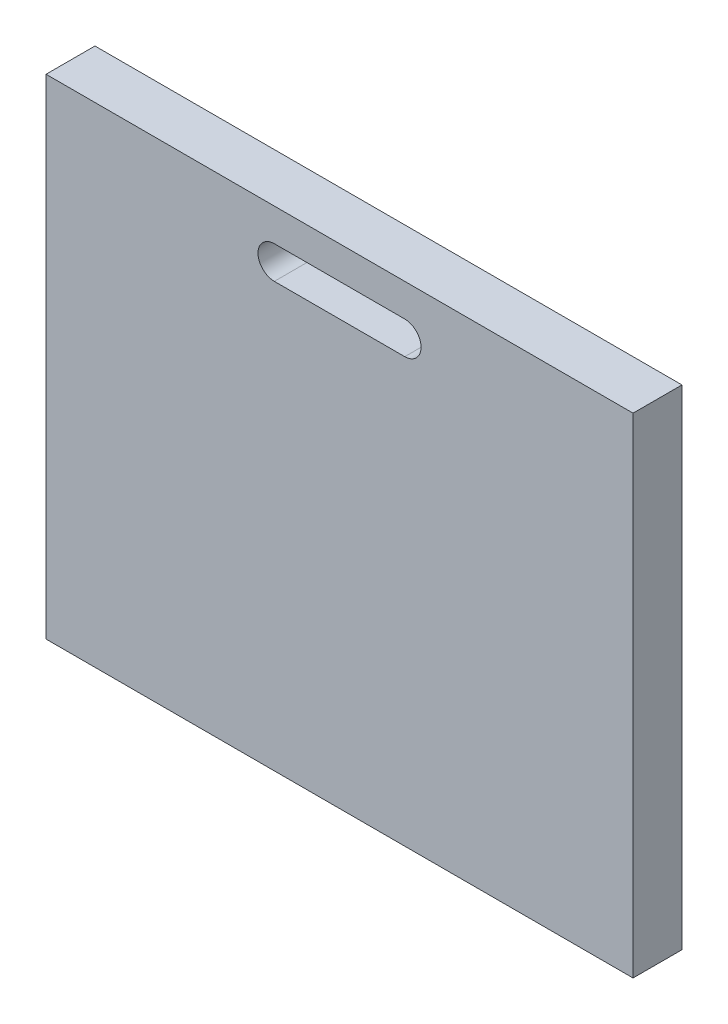
ISO-10303-21;
HEADER;
FILE_DESCRIPTION(('STEP AP214'),'2;1');
FILE_NAME('part.step','',(''),(''),'','','');
FILE_SCHEMA(('AUTOMOTIVE_DESIGN { 1 0 10303 214 1 1 1 1 }'));
ENDSEC;
DATA;
#1=APPLICATION_CONTEXT('core data for automotive mechanical design processes');
#2=APPLICATION_PROTOCOL_DEFINITION('international standard','automotive_design',2000,#1);
#3=PRODUCT_CONTEXT('',#1,'mechanical');
#4=PRODUCT('Part','Part','',(#3));
#5=PRODUCT_RELATED_PRODUCT_CATEGORY('part','',(#4));
#6=PRODUCT_DEFINITION_FORMATION('','',#4);
#7=PRODUCT_DEFINITION_CONTEXT('part definition',#1,'design');
#8=PRODUCT_DEFINITION('design','',#6,#7);
#9=PRODUCT_DEFINITION_SHAPE('','',#8);
#10=(LENGTH_UNIT() NAMED_UNIT(*) SI_UNIT(.MILLI.,.METRE.));
#11=(NAMED_UNIT(*) PLANE_ANGLE_UNIT() SI_UNIT($,.RADIAN.));
#12=(NAMED_UNIT(*) SI_UNIT($,.STERADIAN.) SOLID_ANGLE_UNIT());
#13=UNCERTAINTY_MEASURE_WITH_UNIT(LENGTH_MEASURE(1.E-05),#10,'distance_accuracy_value','');
#14=(GEOMETRIC_REPRESENTATION_CONTEXT(3) GLOBAL_UNCERTAINTY_ASSIGNED_CONTEXT((#13)) GLOBAL_UNIT_ASSIGNED_CONTEXT((#10,
#11,#12)) REPRESENTATION_CONTEXT('',''));
#15=CARTESIAN_POINT('',(0.,0.,0.));
#16=DIRECTION('',(0.,0.,1.));
#17=DIRECTION('',(1.,0.,0.));
#18=AXIS2_PLACEMENT_3D('',#15,#16,#17);
#19=CARTESIAN_POINT('',(0.,0.,15.));
#20=DIRECTION('',(0.,0.,1.));
#21=DIRECTION('',(1.,0.,0.));
#22=AXIS2_PLACEMENT_3D('',#19,#20,#21);
#23=PLANE('',#22);
#24=DIRECTION('',(0.,-1.,0.));
#25=VECTOR('',#24,1.);
#26=CARTESIAN_POINT('',(-153.845623040864,71.2851888322522,15.));
#27=LINE('',#26,#25);
#28=CARTESIAN_POINT('',(-153.845623040864,71.2851888322522,15.));
#29=VERTEX_POINT('',#28);
#30=CARTESIAN_POINT('',(-153.845623040864,-78.7148111677478,15.));
#31=VERTEX_POINT('',#30);
#32=EDGE_CURVE('E153',#29,#31,#27,.T.);
#33=ORIENTED_EDGE('',*,*,#32,.T.);
#34=DIRECTION('',(1.,0.,0.));
#35=VECTOR('',#34,1.);
#36=CARTESIAN_POINT('',(-153.845623040864,-78.7148111677478,15.));
#37=LINE('',#36,#35);
#38=CARTESIAN_POINT('',(26.1543769591361,-78.7148111677478,15.));
#39=VERTEX_POINT('',#38);
#40=EDGE_CURVE('E157',#31,#39,#37,.T.);
#41=ORIENTED_EDGE('',*,*,#40,.T.);
#42=DIRECTION('',(0.,1.,0.));
#43=VECTOR('',#42,1.);
#44=CARTESIAN_POINT('',(26.154376959136,71.2851888322522,15.));
#45=LINE('',#44,#43);
#46=CARTESIAN_POINT('',(26.154376959136,71.2851888322522,15.));
#47=VERTEX_POINT('',#46);
#48=EDGE_CURVE('E161',#39,#47,#45,.T.);
#49=ORIENTED_EDGE('',*,*,#48,.T.);
#50=DIRECTION('',(-1.,0.,0.));
#51=VECTOR('',#50,1.);
#52=CARTESIAN_POINT('',(-153.845623040864,71.2851888322522,15.));
#53=LINE('',#52,#51);
#54=EDGE_CURVE('E164',#47,#29,#53,.T.);
#55=ORIENTED_EDGE('',*,*,#54,.T.);
#56=EDGE_LOOP('',(#33,#41,#49,#55));
#57=FACE_BOUND('',#56,.T.);
#58=DIRECTION('',(1.,0.,0.));
#59=VECTOR('',#58,1.);
#60=CARTESIAN_POINT('',(-83.845623040864,51.2851888322521,15.));
#61=LINE('',#60,#59);
#62=CARTESIAN_POINT('',(-83.845623040864,51.2851888322521,15.));
#63=VERTEX_POINT('',#62);
#64=CARTESIAN_POINT('',(-43.845623040864,51.2851888322522,15.));
#65=VERTEX_POINT('',#64);
#66=EDGE_CURVE('E114',#63,#65,#61,.T.);
#67=ORIENTED_EDGE('',*,*,#66,.F.);
#68=CARTESIAN_POINT('',(-83.845623040864,56.2851888322522,15.));
#69=DIRECTION('',(0.,0.,1.));
#70=DIRECTION('',(1.,0.,0.));
#71=AXIS2_PLACEMENT_3D('',#68,#69,#70);
#72=CIRCLE('',#71,5.);
#73=CARTESIAN_POINT('',(-83.845623040864,61.2851888322521,15.));
#74=VERTEX_POINT('',#73);
#75=EDGE_CURVE('E105',#74,#63,#72,.T.);
#76=ORIENTED_EDGE('',*,*,#75,.F.);
#77=DIRECTION('',(-1.,0.,0.));
#78=VECTOR('',#77,1.);
#79=CARTESIAN_POINT('',(-83.845623040864,61.2851888322521,15.));
#80=LINE('',#79,#78);
#81=CARTESIAN_POINT('',(-43.845623040864,61.2851888322522,15.));
#82=VERTEX_POINT('',#81);
#83=EDGE_CURVE('E131',#82,#74,#80,.T.);
#84=ORIENTED_EDGE('',*,*,#83,.F.);
#85=CARTESIAN_POINT('',(-43.845623040864,56.2851888322522,15.));
#86=DIRECTION('',(0.,0.,1.));
#87=DIRECTION('',(1.,0.,0.));
#88=AXIS2_PLACEMENT_3D('',#85,#86,#87);
#89=CIRCLE('',#88,5.);
#90=EDGE_CURVE('E127',#65,#82,#89,.T.);
#91=ORIENTED_EDGE('',*,*,#90,.F.);
#92=EDGE_LOOP('',(#67,#76,#84,#91));
#93=FACE_BOUND('',#92,.T.);
#94=ADVANCED_FACE('F39',(#57,#93),#23,.T.);
#95=CARTESIAN_POINT('',(0.,0.,0.));
#96=DIRECTION('',(0.,0.,1.));
#97=DIRECTION('',(1.,0.,0.));
#98=AXIS2_PLACEMENT_3D('',#95,#96,#97);
#99=PLANE('',#98);
#100=DIRECTION('',(0.,-1.,0.));
#101=VECTOR('',#100,1.);
#102=CARTESIAN_POINT('',(-153.845623040864,71.2851888322522,0.));
#103=LINE('',#102,#101);
#104=CARTESIAN_POINT('',(-153.845623040864,71.2851888322522,0.));
#105=VERTEX_POINT('',#104);
#106=CARTESIAN_POINT('',(-153.845623040864,-78.7148111677478,0.));
#107=VERTEX_POINT('',#106);
#108=EDGE_CURVE('E123',#105,#107,#103,.T.);
#109=ORIENTED_EDGE('',*,*,#108,.F.);
#110=DIRECTION('',(-1.,0.,0.));
#111=VECTOR('',#110,1.);
#112=CARTESIAN_POINT('',(-153.845623040864,71.2851888322522,0.));
#113=LINE('',#112,#111);
#114=CARTESIAN_POINT('',(26.154376959136,71.2851888322522,0.));
#115=VERTEX_POINT('',#114);
#116=EDGE_CURVE('E158',#115,#105,#113,.T.);
#117=ORIENTED_EDGE('',*,*,#116,.F.);
#118=DIRECTION('',(0.,1.,0.));
#119=VECTOR('',#118,1.);
#120=CARTESIAN_POINT('',(26.154376959136,71.2851888322522,0.));
#121=LINE('',#120,#119);
#122=CARTESIAN_POINT('',(26.1543769591361,-78.7148111677478,0.));
#123=VERTEX_POINT('',#122);
#124=EDGE_CURVE('E174',#123,#115,#121,.T.);
#125=ORIENTED_EDGE('',*,*,#124,.F.);
#126=DIRECTION('',(1.,0.,0.));
#127=VECTOR('',#126,1.);
#128=CARTESIAN_POINT('',(-153.845623040864,-78.7148111677478,0.));
#129=LINE('',#128,#127);
#130=EDGE_CURVE('E171',#107,#123,#129,.T.);
#131=ORIENTED_EDGE('',*,*,#130,.F.);
#132=EDGE_LOOP('',(#109,#117,#125,#131));
#133=FACE_BOUND('',#132,.T.);
#134=CARTESIAN_POINT('',(-83.845623040864,56.2851888322522,0.));
#135=DIRECTION('',(0.,0.,1.));
#136=DIRECTION('',(1.,0.,0.));
#137=AXIS2_PLACEMENT_3D('',#134,#135,#136);
#138=CIRCLE('',#137,5.);
#139=CARTESIAN_POINT('',(-83.845623040864,61.2851888322521,0.));
#140=VERTEX_POINT('',#139);
#141=CARTESIAN_POINT('',(-83.845623040864,51.2851888322521,0.));
#142=VERTEX_POINT('',#141);
#143=EDGE_CURVE('E63',#140,#142,#138,.T.);
#144=ORIENTED_EDGE('',*,*,#143,.T.);
#145=DIRECTION('',(1.,0.,0.));
#146=VECTOR('',#145,1.);
#147=CARTESIAN_POINT('',(-83.845623040864,51.2851888322521,0.));
#148=LINE('',#147,#146);
#149=CARTESIAN_POINT('',(-43.845623040864,51.2851888322522,0.));
#150=VERTEX_POINT('',#149);
#151=EDGE_CURVE('E121',#142,#150,#148,.T.);
#152=ORIENTED_EDGE('',*,*,#151,.T.);
#153=CARTESIAN_POINT('',(-43.845623040864,56.2851888322522,0.));
#154=DIRECTION('',(0.,0.,1.));
#155=DIRECTION('',(1.,0.,0.));
#156=AXIS2_PLACEMENT_3D('',#153,#154,#155);
#157=CIRCLE('',#156,5.);
#158=CARTESIAN_POINT('',(-43.845623040864,61.2851888322522,0.));
#159=VERTEX_POINT('',#158);
#160=EDGE_CURVE('E140',#150,#159,#157,.T.);
#161=ORIENTED_EDGE('',*,*,#160,.T.);
#162=DIRECTION('',(-1.,0.,0.));
#163=VECTOR('',#162,1.);
#164=CARTESIAN_POINT('',(-83.845623040864,61.2851888322521,0.));
#165=LINE('',#164,#163);
#166=EDGE_CURVE('E115',#159,#140,#165,.T.);
#167=ORIENTED_EDGE('',*,*,#166,.T.);
#168=EDGE_LOOP('',(#144,#152,#161,#167));
#169=FACE_BOUND('',#168,.T.);
#170=ADVANCED_FACE('F197',(#133,#169),#99,.F.);
#171=CARTESIAN_POINT('',(-153.845623040864,71.2851888322522,15.));
#172=DIRECTION('',(1.,0.,0.));
#173=DIRECTION('',(0.,1.,0.));
#174=AXIS2_PLACEMENT_3D('',#171,#172,#173);
#175=PLANE('',#174);
#176=ORIENTED_EDGE('',*,*,#108,.T.);
#177=DIRECTION('',(0.,0.,-1.));
#178=VECTOR('',#177,1.);
#179=CARTESIAN_POINT('',(-153.845623040864,-78.7148111677478,15.));
#180=LINE('',#179,#178);
#181=EDGE_CURVE('E11',#31,#107,#180,.T.);
#182=ORIENTED_EDGE('',*,*,#181,.F.);
#183=ORIENTED_EDGE('',*,*,#32,.F.);
#184=DIRECTION('',(0.,0.,-1.));
#185=VECTOR('',#184,1.);
#186=CARTESIAN_POINT('',(-153.845623040864,71.2851888322522,15.));
#187=LINE('',#186,#185);
#188=EDGE_CURVE('E167',#29,#105,#187,.T.);
#189=ORIENTED_EDGE('',*,*,#188,.T.);
#190=EDGE_LOOP('',(#176,#182,#183,#189));
#191=FACE_BOUND('',#190,.T.);
#192=ADVANCED_FACE('F41',(#191),#175,.F.);
#193=CARTESIAN_POINT('',(-153.845623040864,-78.7148111677478,15.));
#194=DIRECTION('',(0.,1.,0.));
#195=DIRECTION('',(0.,0.,1.));
#196=AXIS2_PLACEMENT_3D('',#193,#194,#195);
#197=PLANE('',#196);
#198=ORIENTED_EDGE('',*,*,#130,.T.);
#199=DIRECTION('',(0.,0.,-1.));
#200=VECTOR('',#199,1.);
#201=CARTESIAN_POINT('',(26.1543769591361,-78.7148111677478,15.));
#202=LINE('',#201,#200);
#203=EDGE_CURVE('E48',#39,#123,#202,.T.);
#204=ORIENTED_EDGE('',*,*,#203,.F.);
#205=ORIENTED_EDGE('',*,*,#40,.F.);
#206=ORIENTED_EDGE('',*,*,#181,.T.);
#207=EDGE_LOOP('',(#198,#204,#205,#206));
#208=FACE_BOUND('',#207,.T.);
#209=ADVANCED_FACE('F207',(#208),#197,.F.);
#210=CARTESIAN_POINT('',(26.154376959136,71.2851888322522,15.));
#211=DIRECTION('',(-1.,0.,0.));
#212=DIRECTION('',(0.,-1.,0.));
#213=AXIS2_PLACEMENT_3D('',#210,#211,#212);
#214=PLANE('',#213);
#215=ORIENTED_EDGE('',*,*,#124,.T.);
#216=DIRECTION('',(0.,0.,-1.));
#217=VECTOR('',#216,1.);
#218=CARTESIAN_POINT('',(26.154376959136,71.2851888322522,15.));
#219=LINE('',#218,#217);
#220=EDGE_CURVE('E182',#47,#115,#219,.T.);
#221=ORIENTED_EDGE('',*,*,#220,.F.);
#222=ORIENTED_EDGE('',*,*,#48,.F.);
#223=ORIENTED_EDGE('',*,*,#203,.T.);
#224=EDGE_LOOP('',(#215,#221,#222,#223));
#225=FACE_BOUND('',#224,.T.);
#226=ADVANCED_FACE('F191',(#225),#214,.F.);
#227=CARTESIAN_POINT('',(-153.845623040864,71.2851888322522,15.));
#228=DIRECTION('',(0.,-1.,0.));
#229=DIRECTION('',(0.,0.,-1.));
#230=AXIS2_PLACEMENT_3D('',#227,#228,#229);
#231=PLANE('',#230);
#232=ORIENTED_EDGE('',*,*,#116,.T.);
#233=ORIENTED_EDGE('',*,*,#188,.F.);
#234=ORIENTED_EDGE('',*,*,#54,.F.);
#235=ORIENTED_EDGE('',*,*,#220,.T.);
#236=EDGE_LOOP('',(#232,#233,#234,#235));
#237=FACE_BOUND('',#236,.T.);
#238=ADVANCED_FACE('F201',(#237),#231,.F.);
#239=CARTESIAN_POINT('',(-83.845623040864,56.2851888322522,15.));
#240=DIRECTION('',(0.,0.,-1.));
#241=DIRECTION('',(-1.,0.,0.));
#242=AXIS2_PLACEMENT_3D('',#239,#240,#241);
#243=CYLINDRICAL_SURFACE('',#242,5.);
#244=ORIENTED_EDGE('',*,*,#143,.F.);
#245=DIRECTION('',(0.,0.,-1.));
#246=VECTOR('',#245,1.);
#247=CARTESIAN_POINT('',(-83.845623040864,61.2851888322521,15.));
#248=LINE('',#247,#246);
#249=EDGE_CURVE('E109',#74,#140,#248,.T.);
#250=ORIENTED_EDGE('',*,*,#249,.F.);
#251=ORIENTED_EDGE('',*,*,#75,.T.);
#252=DIRECTION('',(0.,0.,-1.));
#253=VECTOR('',#252,1.);
#254=CARTESIAN_POINT('',(-83.845623040864,51.2851888322521,15.));
#255=LINE('',#254,#253);
#256=EDGE_CURVE('E108',#63,#142,#255,.T.);
#257=ORIENTED_EDGE('',*,*,#256,.T.);
#258=EDGE_LOOP('',(#244,#250,#251,#257));
#259=FACE_BOUND('',#258,.T.);
#260=ADVANCED_FACE('F107',(#259),#243,.F.);
#261=CARTESIAN_POINT('',(-83.845623040864,51.2851888322521,15.));
#262=DIRECTION('',(0.,1.,0.));
#263=DIRECTION('',(-1.,0.,0.));
#264=AXIS2_PLACEMENT_3D('',#261,#262,#263);
#265=PLANE('',#264);
#266=ORIENTED_EDGE('',*,*,#151,.F.);
#267=ORIENTED_EDGE('',*,*,#256,.F.);
#268=ORIENTED_EDGE('',*,*,#66,.T.);
#269=DIRECTION('',(0.,0.,-1.));
#270=VECTOR('',#269,1.);
#271=CARTESIAN_POINT('',(-43.845623040864,51.2851888322522,15.));
#272=LINE('',#271,#270);
#273=EDGE_CURVE('E124',#65,#150,#272,.T.);
#274=ORIENTED_EDGE('',*,*,#273,.T.);
#275=EDGE_LOOP('',(#266,#267,#268,#274));
#276=FACE_BOUND('',#275,.T.);
#277=ADVANCED_FACE('F118',(#276),#265,.T.);
#278=CARTESIAN_POINT('',(-43.845623040864,56.2851888322522,15.));
#279=DIRECTION('',(0.,0.,-1.));
#280=DIRECTION('',(-1.,0.,0.));
#281=AXIS2_PLACEMENT_3D('',#278,#279,#280);
#282=CYLINDRICAL_SURFACE('',#281,5.);
#283=ORIENTED_EDGE('',*,*,#160,.F.);
#284=ORIENTED_EDGE('',*,*,#273,.F.);
#285=ORIENTED_EDGE('',*,*,#90,.T.);
#286=DIRECTION('',(0.,0.,-1.));
#287=VECTOR('',#286,1.);
#288=CARTESIAN_POINT('',(-43.845623040864,61.2851888322522,15.));
#289=LINE('',#288,#287);
#290=EDGE_CURVE('E55',#82,#159,#289,.T.);
#291=ORIENTED_EDGE('',*,*,#290,.T.);
#292=EDGE_LOOP('',(#283,#284,#285,#291));
#293=FACE_BOUND('',#292,.T.);
#294=ADVANCED_FACE('F230',(#293),#282,.F.);
#295=CARTESIAN_POINT('',(-83.845623040864,61.2851888322521,15.));
#296=DIRECTION('',(0.,-1.,0.));
#297=DIRECTION('',(1.,0.,0.));
#298=AXIS2_PLACEMENT_3D('',#295,#296,#297);
#299=PLANE('',#298);
#300=ORIENTED_EDGE('',*,*,#166,.F.);
#301=ORIENTED_EDGE('',*,*,#290,.F.);
#302=ORIENTED_EDGE('',*,*,#83,.T.);
#303=ORIENTED_EDGE('',*,*,#249,.T.);
#304=EDGE_LOOP('',(#300,#301,#302,#303));
#305=FACE_BOUND('',#304,.T.);
#306=ADVANCED_FACE('F234',(#305),#299,.T.);
#307=CLOSED_SHELL('',(#94,#170,#192,#209,#226,#238,#260,#277,#294,#306));
#308=MANIFOLD_SOLID_BREP('B2',#307);
#309=ADVANCED_BREP_SHAPE_REPRESENTATION('',(#18,#308),#14);
#310=SHAPE_DEFINITION_REPRESENTATION(#9,#309);
ENDSEC;
END-ISO-10303-21;
